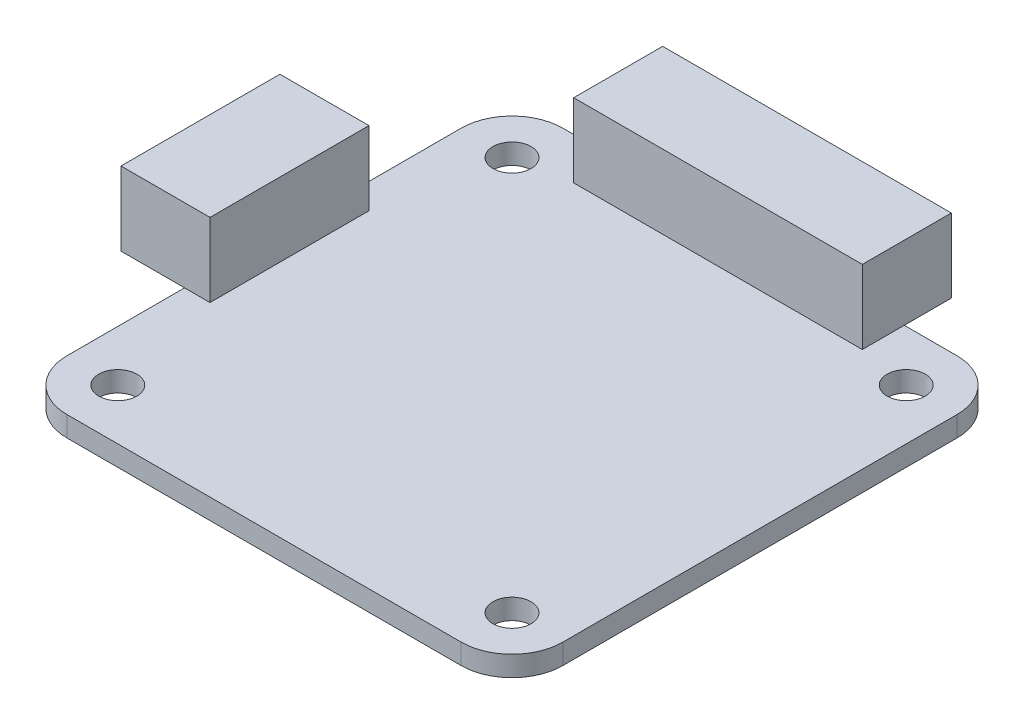
ISO-10303-21;
HEADER;
FILE_DESCRIPTION(('STEP AP214'),'2;1');
FILE_NAME('part.step','',(''),(''),'','','');
FILE_SCHEMA(('AUTOMOTIVE_DESIGN { 1 0 10303 214 1 1 1 1 }'));
ENDSEC;
DATA;
#1=APPLICATION_CONTEXT('core data for automotive mechanical design processes');
#2=APPLICATION_PROTOCOL_DEFINITION('international standard','automotive_design',2000,#1);
#3=PRODUCT_CONTEXT('',#1,'mechanical');
#4=PRODUCT('Part','Part','',(#3));
#5=PRODUCT_RELATED_PRODUCT_CATEGORY('part','',(#4));
#6=PRODUCT_DEFINITION_FORMATION('','',#4);
#7=PRODUCT_DEFINITION_CONTEXT('part definition',#1,'design');
#8=PRODUCT_DEFINITION('design','',#6,#7);
#9=PRODUCT_DEFINITION_SHAPE('','',#8);
#10=(LENGTH_UNIT() NAMED_UNIT(*) SI_UNIT(.MILLI.,.METRE.));
#11=(NAMED_UNIT(*) PLANE_ANGLE_UNIT() SI_UNIT($,.RADIAN.));
#12=(NAMED_UNIT(*) SI_UNIT($,.STERADIAN.) SOLID_ANGLE_UNIT());
#13=UNCERTAINTY_MEASURE_WITH_UNIT(LENGTH_MEASURE(1.E-05),#10,'distance_accuracy_value','');
#14=(GEOMETRIC_REPRESENTATION_CONTEXT(3) GLOBAL_UNCERTAINTY_ASSIGNED_CONTEXT((#13)) GLOBAL_UNIT_ASSIGNED_CONTEXT((#10,
#11,#12)) REPRESENTATION_CONTEXT('',''));
#15=CARTESIAN_POINT('',(0.,0.,0.));
#16=DIRECTION('',(0.,0.,1.));
#17=DIRECTION('',(1.,0.,0.));
#18=AXIS2_PLACEMENT_3D('',#15,#16,#17);
#19=CARTESIAN_POINT('',(-15.5,1.6,15.5));
#20=DIRECTION('',(0.,1.,0.));
#21=DIRECTION('',(0.,0.,1.));
#22=AXIS2_PLACEMENT_3D('',#19,#20,#21);
#23=PLANE('',#22);
#24=DIRECTION('',(1.,0.,0.));
#25=VECTOR('',#24,1.);
#26=CARTESIAN_POINT('',(-15.5,1.6,-6.25));
#27=LINE('',#26,#25);
#28=CARTESIAN_POINT('',(-19.5,1.6,-6.25));
#29=VERTEX_POINT('',#28);
#30=CARTESIAN_POINT('',(-17.5,1.6,-6.25));
#31=VERTEX_POINT('',#30);
#32=EDGE_CURVE('E52',#29,#31,#27,.T.);
#33=ORIENTED_EDGE('',*,*,#32,.T.);
#34=DIRECTION('',(0.,0.,1.));
#35=VECTOR('',#34,1.);
#36=CARTESIAN_POINT('',(-17.5,1.6,15.5));
#37=LINE('',#36,#35);
#38=CARTESIAN_POINT('',(-17.5,1.6,6.25));
#39=VERTEX_POINT('',#38);
#40=EDGE_CURVE('E57',#31,#39,#37,.T.);
#41=ORIENTED_EDGE('',*,*,#40,.T.);
#42=DIRECTION('',(-1.,0.,0.));
#43=VECTOR('',#42,1.);
#44=CARTESIAN_POINT('',(-15.5,1.6,6.25000000000001));
#45=LINE('',#44,#43);
#46=CARTESIAN_POINT('',(-19.5,1.6,6.25));
#47=VERTEX_POINT('',#46);
#48=EDGE_CURVE('E169',#39,#47,#45,.T.);
#49=ORIENTED_EDGE('',*,*,#48,.T.);
#50=DIRECTION('',(0.,0.,1.));
#51=VECTOR('',#50,1.);
#52=CARTESIAN_POINT('',(-19.5,1.6,15.5));
#53=LINE('',#52,#51);
#54=CARTESIAN_POINT('',(-19.5,1.6,15.5));
#55=VERTEX_POINT('',#54);
#56=EDGE_CURVE('E281',#47,#55,#53,.T.);
#57=ORIENTED_EDGE('',*,*,#56,.T.);
#58=CARTESIAN_POINT('',(-15.5,1.6,15.5));
#59=DIRECTION('',(0.,1.,0.));
#60=DIRECTION('',(0.,0.,1.));
#61=AXIS2_PLACEMENT_3D('',#58,#59,#60);
#62=CIRCLE('',#61,4.);
#63=CARTESIAN_POINT('',(-15.5,1.6,19.5));
#64=VERTEX_POINT('',#63);
#65=EDGE_CURVE('E262',#55,#64,#62,.T.);
#66=ORIENTED_EDGE('',*,*,#65,.T.);
#67=DIRECTION('',(1.,0.,0.));
#68=VECTOR('',#67,1.);
#69=CARTESIAN_POINT('',(-15.5,1.6,19.5));
#70=LINE('',#69,#68);
#71=CARTESIAN_POINT('',(15.5,1.6,19.5));
#72=VERTEX_POINT('',#71);
#73=EDGE_CURVE('E265',#64,#72,#70,.T.);
#74=ORIENTED_EDGE('',*,*,#73,.T.);
#75=CARTESIAN_POINT('',(15.5,1.6,15.5));
#76=DIRECTION('',(0.,1.,0.));
#77=DIRECTION('',(0.,0.,1.));
#78=AXIS2_PLACEMENT_3D('',#75,#76,#77);
#79=CIRCLE('',#78,4.);
#80=CARTESIAN_POINT('',(19.5,1.6,15.5));
#81=VERTEX_POINT('',#80);
#82=EDGE_CURVE('E268',#72,#81,#79,.T.);
#83=ORIENTED_EDGE('',*,*,#82,.T.);
#84=DIRECTION('',(0.,0.,-1.));
#85=VECTOR('',#84,1.);
#86=CARTESIAN_POINT('',(19.5,1.6,15.5));
#87=LINE('',#86,#85);
#88=CARTESIAN_POINT('',(19.5,1.6,-15.5));
#89=VERTEX_POINT('',#88);
#90=EDGE_CURVE('E270',#81,#89,#87,.T.);
#91=ORIENTED_EDGE('',*,*,#90,.T.);
#92=CARTESIAN_POINT('',(15.5,1.6,-15.5));
#93=DIRECTION('',(0.,1.,0.));
#94=DIRECTION('',(0.,0.,1.));
#95=AXIS2_PLACEMENT_3D('',#92,#93,#94);
#96=CIRCLE('',#95,4.);
#97=CARTESIAN_POINT('',(15.5,1.6,-19.5));
#98=VERTEX_POINT('',#97);
#99=EDGE_CURVE('E272',#89,#98,#96,.T.);
#100=ORIENTED_EDGE('',*,*,#99,.T.);
#101=DIRECTION('',(-1.,0.,0.));
#102=VECTOR('',#101,1.);
#103=CARTESIAN_POINT('',(-15.5,1.6,-19.5));
#104=LINE('',#103,#102);
#105=CARTESIAN_POINT('',(11.35,1.6,-19.5));
#106=VERTEX_POINT('',#105);
#107=EDGE_CURVE('E275',#98,#106,#104,.T.);
#108=ORIENTED_EDGE('',*,*,#107,.T.);
#109=DIRECTION('',(0.,0.,1.));
#110=VECTOR('',#109,1.);
#111=CARTESIAN_POINT('',(11.35,1.6,15.5));
#112=LINE('',#111,#110);
#113=CARTESIAN_POINT('',(11.35,1.6,-16.2));
#114=VERTEX_POINT('',#113);
#115=EDGE_CURVE('E11',#106,#114,#112,.T.);
#116=ORIENTED_EDGE('',*,*,#115,.T.);
#117=DIRECTION('',(-1.,0.,0.));
#118=VECTOR('',#117,1.);
#119=CARTESIAN_POINT('',(-15.5,1.6,-16.2));
#120=LINE('',#119,#118);
#121=CARTESIAN_POINT('',(-11.35,1.6,-16.2));
#122=VERTEX_POINT('',#121);
#123=EDGE_CURVE('E201',#114,#122,#120,.T.);
#124=ORIENTED_EDGE('',*,*,#123,.T.);
#125=DIRECTION('',(0.,0.,-1.));
#126=VECTOR('',#125,1.);
#127=CARTESIAN_POINT('',(-11.35,1.6,15.5));
#128=LINE('',#127,#126);
#129=CARTESIAN_POINT('',(-11.35,1.6,-19.5));
#130=VERTEX_POINT('',#129);
#131=EDGE_CURVE('E221',#122,#130,#128,.T.);
#132=ORIENTED_EDGE('',*,*,#131,.T.);
#133=CARTESIAN_POINT('',(-15.5,1.6,-19.5));
#134=VERTEX_POINT('',#133);
#135=EDGE_CURVE('E274',#130,#134,#104,.T.);
#136=ORIENTED_EDGE('',*,*,#135,.T.);
#137=CARTESIAN_POINT('',(-15.5,1.6,-15.5));
#138=DIRECTION('',(0.,1.,0.));
#139=DIRECTION('',(0.,0.,1.));
#140=AXIS2_PLACEMENT_3D('',#137,#138,#139);
#141=CIRCLE('',#140,4.);
#142=CARTESIAN_POINT('',(-19.5,1.6,-15.5));
#143=VERTEX_POINT('',#142);
#144=EDGE_CURVE('E278',#134,#143,#141,.T.);
#145=ORIENTED_EDGE('',*,*,#144,.T.);
#146=EDGE_CURVE('E282',#143,#29,#53,.T.);
#147=ORIENTED_EDGE('',*,*,#146,.T.);
#148=EDGE_LOOP('',(#33,#41,#49,#57,#66,#74,#83,#91,#100,#108,#116,#124,#132,#136,#145,#147));
#149=FACE_BOUND('',#148,.T.);
#150=CARTESIAN_POINT('',(-15.5,1.6,-15.5));
#151=DIRECTION('',(0.,1.,0.));
#152=DIRECTION('',(0.,0.,1.));
#153=AXIS2_PLACEMENT_3D('',#150,#151,#152);
#154=CIRCLE('',#153,1.5);
#155=CARTESIAN_POINT('',(-15.5,1.6,-14.));
#156=VERTEX_POINT('',#155);
#157=EDGE_CURVE('E244',#156,#156,#154,.T.);
#158=ORIENTED_EDGE('',*,*,#157,.F.);
#159=EDGE_LOOP('',(#158));
#160=FACE_BOUND('',#159,.T.);
#161=CARTESIAN_POINT('',(-15.5,1.6,15.5));
#162=DIRECTION('',(0.,1.,0.));
#163=DIRECTION('',(0.,0.,1.));
#164=AXIS2_PLACEMENT_3D('',#161,#162,#163);
#165=CIRCLE('',#164,1.5);
#166=CARTESIAN_POINT('',(-15.5,1.6,17.));
#167=VERTEX_POINT('',#166);
#168=EDGE_CURVE('E256',#167,#167,#165,.T.);
#169=ORIENTED_EDGE('',*,*,#168,.F.);
#170=EDGE_LOOP('',(#169));
#171=FACE_BOUND('',#170,.T.);
#172=CARTESIAN_POINT('',(15.5,1.6,15.5));
#173=DIRECTION('',(0.,1.,0.));
#174=DIRECTION('',(0.,0.,1.));
#175=AXIS2_PLACEMENT_3D('',#172,#173,#174);
#176=CIRCLE('',#175,1.5);
#177=CARTESIAN_POINT('',(15.5,1.6,17.));
#178=VERTEX_POINT('',#177);
#179=EDGE_CURVE('E250',#178,#178,#176,.T.);
#180=ORIENTED_EDGE('',*,*,#179,.F.);
#181=EDGE_LOOP('',(#180));
#182=FACE_BOUND('',#181,.T.);
#183=CARTESIAN_POINT('',(15.5,1.6,-15.5));
#184=DIRECTION('',(0.,1.,0.));
#185=DIRECTION('',(0.,0.,1.));
#186=AXIS2_PLACEMENT_3D('',#183,#184,#185);
#187=CIRCLE('',#186,1.5);
#188=CARTESIAN_POINT('',(15.5,1.6,-14.));
#189=VERTEX_POINT('',#188);
#190=EDGE_CURVE('E238',#189,#189,#187,.T.);
#191=ORIENTED_EDGE('',*,*,#190,.F.);
#192=EDGE_LOOP('',(#191));
#193=FACE_BOUND('',#192,.T.);
#194=ADVANCED_FACE('F35',(#149,#160,#171,#182,#193),#23,.T.);
#195=CARTESIAN_POINT('',(-15.5,0.,15.5));
#196=DIRECTION('',(0.,1.,0.));
#197=DIRECTION('',(0.,0.,1.));
#198=AXIS2_PLACEMENT_3D('',#195,#196,#197);
#199=PLANE('',#198);
#200=CARTESIAN_POINT('',(-15.5,0.,15.5));
#201=DIRECTION('',(0.,1.,0.));
#202=DIRECTION('',(0.,0.,1.));
#203=AXIS2_PLACEMENT_3D('',#200,#201,#202);
#204=CIRCLE('',#203,4.);
#205=CARTESIAN_POINT('',(-19.5,0.,15.5));
#206=VERTEX_POINT('',#205);
#207=CARTESIAN_POINT('',(-15.5,0.,19.5));
#208=VERTEX_POINT('',#207);
#209=EDGE_CURVE('E259',#206,#208,#204,.T.);
#210=ORIENTED_EDGE('',*,*,#209,.F.);
#211=DIRECTION('',(0.,0.,1.));
#212=VECTOR('',#211,1.);
#213=CARTESIAN_POINT('',(-19.5,0.,15.5));
#214=LINE('',#213,#212);
#215=CARTESIAN_POINT('',(-19.5,0.,-15.5));
#216=VERTEX_POINT('',#215);
#217=EDGE_CURVE('E266',#216,#206,#214,.T.);
#218=ORIENTED_EDGE('',*,*,#217,.F.);
#219=CARTESIAN_POINT('',(-15.5,0.,-15.5));
#220=DIRECTION('',(0.,1.,0.));
#221=DIRECTION('',(0.,0.,1.));
#222=AXIS2_PLACEMENT_3D('',#219,#220,#221);
#223=CIRCLE('',#222,4.);
#224=CARTESIAN_POINT('',(-15.5,0.,-19.5));
#225=VERTEX_POINT('',#224);
#226=EDGE_CURVE('E298',#225,#216,#223,.T.);
#227=ORIENTED_EDGE('',*,*,#226,.F.);
#228=DIRECTION('',(-1.,0.,0.));
#229=VECTOR('',#228,1.);
#230=CARTESIAN_POINT('',(-15.5,0.,-19.5));
#231=LINE('',#230,#229);
#232=CARTESIAN_POINT('',(15.5,0.,-19.5));
#233=VERTEX_POINT('',#232);
#234=EDGE_CURVE('E296',#233,#225,#231,.T.);
#235=ORIENTED_EDGE('',*,*,#234,.F.);
#236=CARTESIAN_POINT('',(15.5,0.,-15.5));
#237=DIRECTION('',(0.,1.,0.));
#238=DIRECTION('',(0.,0.,1.));
#239=AXIS2_PLACEMENT_3D('',#236,#237,#238);
#240=CIRCLE('',#239,4.);
#241=CARTESIAN_POINT('',(19.5,0.,-15.5));
#242=VERTEX_POINT('',#241);
#243=EDGE_CURVE('E294',#242,#233,#240,.T.);
#244=ORIENTED_EDGE('',*,*,#243,.F.);
#245=DIRECTION('',(0.,0.,-1.));
#246=VECTOR('',#245,1.);
#247=CARTESIAN_POINT('',(19.5,0.,15.5));
#248=LINE('',#247,#246);
#249=CARTESIAN_POINT('',(19.5,0.,15.5));
#250=VERTEX_POINT('',#249);
#251=EDGE_CURVE('E292',#250,#242,#248,.T.);
#252=ORIENTED_EDGE('',*,*,#251,.F.);
#253=CARTESIAN_POINT('',(15.5,0.,15.5));
#254=DIRECTION('',(0.,1.,0.));
#255=DIRECTION('',(0.,0.,1.));
#256=AXIS2_PLACEMENT_3D('',#253,#254,#255);
#257=CIRCLE('',#256,4.);
#258=CARTESIAN_POINT('',(15.5,0.,19.5));
#259=VERTEX_POINT('',#258);
#260=EDGE_CURVE('E290',#259,#250,#257,.T.);
#261=ORIENTED_EDGE('',*,*,#260,.F.);
#262=DIRECTION('',(1.,0.,0.));
#263=VECTOR('',#262,1.);
#264=CARTESIAN_POINT('',(-15.5,0.,19.5));
#265=LINE('',#264,#263);
#266=EDGE_CURVE('E288',#208,#259,#265,.T.);
#267=ORIENTED_EDGE('',*,*,#266,.F.);
#268=EDGE_LOOP('',(#210,#218,#227,#235,#244,#252,#261,#267));
#269=FACE_BOUND('',#268,.T.);
#270=CARTESIAN_POINT('',(-15.5,0.,15.5));
#271=DIRECTION('',(0.,1.,0.));
#272=DIRECTION('',(0.,0.,1.));
#273=AXIS2_PLACEMENT_3D('',#270,#271,#272);
#274=CIRCLE('',#273,1.5);
#275=CARTESIAN_POINT('',(-15.5,0.,17.));
#276=VERTEX_POINT('',#275);
#277=EDGE_CURVE('E253',#276,#276,#274,.T.);
#278=ORIENTED_EDGE('',*,*,#277,.T.);
#279=EDGE_LOOP('',(#278));
#280=FACE_BOUND('',#279,.T.);
#281=CARTESIAN_POINT('',(15.5,0.,15.5));
#282=DIRECTION('',(0.,1.,0.));
#283=DIRECTION('',(0.,0.,1.));
#284=AXIS2_PLACEMENT_3D('',#281,#282,#283);
#285=CIRCLE('',#284,1.5);
#286=CARTESIAN_POINT('',(15.5,0.,17.));
#287=VERTEX_POINT('',#286);
#288=EDGE_CURVE('E247',#287,#287,#285,.T.);
#289=ORIENTED_EDGE('',*,*,#288,.T.);
#290=EDGE_LOOP('',(#289));
#291=FACE_BOUND('',#290,.T.);
#292=CARTESIAN_POINT('',(-15.5,0.,-15.5));
#293=DIRECTION('',(0.,1.,0.));
#294=DIRECTION('',(0.,0.,1.));
#295=AXIS2_PLACEMENT_3D('',#292,#293,#294);
#296=CIRCLE('',#295,1.5);
#297=CARTESIAN_POINT('',(-15.5,0.,-14.));
#298=VERTEX_POINT('',#297);
#299=EDGE_CURVE('E241',#298,#298,#296,.T.);
#300=ORIENTED_EDGE('',*,*,#299,.T.);
#301=EDGE_LOOP('',(#300));
#302=FACE_BOUND('',#301,.T.);
#303=CARTESIAN_POINT('',(15.5,0.,-15.5));
#304=DIRECTION('',(0.,1.,0.));
#305=DIRECTION('',(0.,0.,1.));
#306=AXIS2_PLACEMENT_3D('',#303,#304,#305);
#307=CIRCLE('',#306,1.5);
#308=CARTESIAN_POINT('',(15.5,0.,-14.));
#309=VERTEX_POINT('',#308);
#310=EDGE_CURVE('E231',#309,#309,#307,.T.);
#311=ORIENTED_EDGE('',*,*,#310,.T.);
#312=EDGE_LOOP('',(#311));
#313=FACE_BOUND('',#312,.T.);
#314=ADVANCED_FACE('F333',(#269,#280,#291,#302,#313),#199,.F.);
#315=CARTESIAN_POINT('',(-15.5,1.6,15.5));
#316=DIRECTION('',(0.,-1.,0.));
#317=DIRECTION('',(0.,0.,-1.));
#318=AXIS2_PLACEMENT_3D('',#315,#316,#317);
#319=CYLINDRICAL_SURFACE('',#318,4.);
#320=ORIENTED_EDGE('',*,*,#209,.T.);
#321=DIRECTION('',(0.,-1.,0.));
#322=VECTOR('',#321,1.);
#323=CARTESIAN_POINT('',(-15.5,1.6,19.5));
#324=LINE('',#323,#322);
#325=EDGE_CURVE('E39',#64,#208,#324,.T.);
#326=ORIENTED_EDGE('',*,*,#325,.F.);
#327=ORIENTED_EDGE('',*,*,#65,.F.);
#328=DIRECTION('',(0.,-1.,0.));
#329=VECTOR('',#328,1.);
#330=CARTESIAN_POINT('',(-19.5,1.6,15.5));
#331=LINE('',#330,#329);
#332=EDGE_CURVE('E284',#55,#206,#331,.T.);
#333=ORIENTED_EDGE('',*,*,#332,.T.);
#334=EDGE_LOOP('',(#320,#326,#327,#333));
#335=FACE_BOUND('',#334,.T.);
#336=ADVANCED_FACE('F37',(#335),#319,.T.);
#337=CARTESIAN_POINT('',(-15.5,1.6,19.5));
#338=DIRECTION('',(0.,0.,-1.));
#339=DIRECTION('',(-1.,0.,0.));
#340=AXIS2_PLACEMENT_3D('',#337,#338,#339);
#341=PLANE('',#340);
#342=ORIENTED_EDGE('',*,*,#266,.T.);
#343=DIRECTION('',(0.,-1.,0.));
#344=VECTOR('',#343,1.);
#345=CARTESIAN_POINT('',(15.5,1.6,19.5));
#346=LINE('',#345,#344);
#347=EDGE_CURVE('E317',#72,#259,#346,.T.);
#348=ORIENTED_EDGE('',*,*,#347,.F.);
#349=ORIENTED_EDGE('',*,*,#73,.F.);
#350=ORIENTED_EDGE('',*,*,#325,.T.);
#351=EDGE_LOOP('',(#342,#348,#349,#350));
#352=FACE_BOUND('',#351,.T.);
#353=ADVANCED_FACE('F326',(#352),#341,.F.);
#354=CARTESIAN_POINT('',(15.5,1.6,15.5));
#355=DIRECTION('',(0.,-1.,0.));
#356=DIRECTION('',(0.,0.,-1.));
#357=AXIS2_PLACEMENT_3D('',#354,#355,#356);
#358=CYLINDRICAL_SURFACE('',#357,4.);
#359=ORIENTED_EDGE('',*,*,#260,.T.);
#360=DIRECTION('',(0.,-1.,0.));
#361=VECTOR('',#360,1.);
#362=CARTESIAN_POINT('',(19.5,1.6,15.5));
#363=LINE('',#362,#361);
#364=EDGE_CURVE('E315',#81,#250,#363,.T.);
#365=ORIENTED_EDGE('',*,*,#364,.F.);
#366=ORIENTED_EDGE('',*,*,#82,.F.);
#367=ORIENTED_EDGE('',*,*,#347,.T.);
#368=EDGE_LOOP('',(#359,#365,#366,#367));
#369=FACE_BOUND('',#368,.T.);
#370=ADVANCED_FACE('F339',(#369),#358,.T.);
#371=CARTESIAN_POINT('',(19.5,1.6,15.5));
#372=DIRECTION('',(-1.,0.,0.));
#373=DIRECTION('',(0.,0.,1.));
#374=AXIS2_PLACEMENT_3D('',#371,#372,#373);
#375=PLANE('',#374);
#376=ORIENTED_EDGE('',*,*,#251,.T.);
#377=DIRECTION('',(0.,-1.,0.));
#378=VECTOR('',#377,1.);
#379=CARTESIAN_POINT('',(19.5,1.6,-15.5));
#380=LINE('',#379,#378);
#381=EDGE_CURVE('E312',#89,#242,#380,.T.);
#382=ORIENTED_EDGE('',*,*,#381,.F.);
#383=ORIENTED_EDGE('',*,*,#90,.F.);
#384=ORIENTED_EDGE('',*,*,#364,.T.);
#385=EDGE_LOOP('',(#376,#382,#383,#384));
#386=FACE_BOUND('',#385,.T.);
#387=ADVANCED_FACE('F342',(#386),#375,.F.);
#388=CARTESIAN_POINT('',(15.5,1.6,-15.5));
#389=DIRECTION('',(0.,-1.,0.));
#390=DIRECTION('',(0.,0.,-1.));
#391=AXIS2_PLACEMENT_3D('',#388,#389,#390);
#392=CYLINDRICAL_SURFACE('',#391,4.);
#393=ORIENTED_EDGE('',*,*,#243,.T.);
#394=DIRECTION('',(0.,-1.,0.));
#395=VECTOR('',#394,1.);
#396=CARTESIAN_POINT('',(15.5,1.6,-19.5));
#397=LINE('',#396,#395);
#398=EDGE_CURVE('E309',#98,#233,#397,.T.);
#399=ORIENTED_EDGE('',*,*,#398,.F.);
#400=ORIENTED_EDGE('',*,*,#99,.F.);
#401=ORIENTED_EDGE('',*,*,#381,.T.);
#402=EDGE_LOOP('',(#393,#399,#400,#401));
#403=FACE_BOUND('',#402,.T.);
#404=ADVANCED_FACE('F363',(#403),#392,.T.);
#405=CARTESIAN_POINT('',(-15.5,1.6,-19.5));
#406=DIRECTION('',(0.,0.,1.));
#407=DIRECTION('',(1.,0.,0.));
#408=AXIS2_PLACEMENT_3D('',#405,#406,#407);
#409=PLANE('',#408);
#410=ORIENTED_EDGE('',*,*,#234,.T.);
#411=DIRECTION('',(0.,-1.,0.));
#412=VECTOR('',#411,1.);
#413=CARTESIAN_POINT('',(-15.5,1.6,-19.5));
#414=LINE('',#413,#412);
#415=EDGE_CURVE('E306',#134,#225,#414,.T.);
#416=ORIENTED_EDGE('',*,*,#415,.F.);
#417=ORIENTED_EDGE('',*,*,#135,.F.);
#418=EDGE_CURVE('E279',#106,#130,#104,.T.);
#419=ORIENTED_EDGE('',*,*,#418,.F.);
#420=ORIENTED_EDGE('',*,*,#107,.F.);
#421=ORIENTED_EDGE('',*,*,#398,.T.);
#422=EDGE_LOOP('',(#410,#416,#417,#419,#420,#421));
#423=FACE_BOUND('',#422,.T.);
#424=ADVANCED_FACE('F358',(#423),#409,.F.);
#425=CARTESIAN_POINT('',(-15.5,1.6,-15.5));
#426=DIRECTION('',(0.,-1.,0.));
#427=DIRECTION('',(0.,0.,-1.));
#428=AXIS2_PLACEMENT_3D('',#425,#426,#427);
#429=CYLINDRICAL_SURFACE('',#428,4.);
#430=ORIENTED_EDGE('',*,*,#226,.T.);
#431=DIRECTION('',(0.,-1.,0.));
#432=VECTOR('',#431,1.);
#433=CARTESIAN_POINT('',(-19.5,1.6,-15.5));
#434=LINE('',#433,#432);
#435=EDGE_CURVE('E303',#143,#216,#434,.T.);
#436=ORIENTED_EDGE('',*,*,#435,.F.);
#437=ORIENTED_EDGE('',*,*,#144,.F.);
#438=ORIENTED_EDGE('',*,*,#415,.T.);
#439=EDGE_LOOP('',(#430,#436,#437,#438));
#440=FACE_BOUND('',#439,.T.);
#441=ADVANCED_FACE('F354',(#440),#429,.T.);
#442=CARTESIAN_POINT('',(-19.5,1.6,15.5));
#443=DIRECTION('',(1.,0.,0.));
#444=DIRECTION('',(0.,0.,-1.));
#445=AXIS2_PLACEMENT_3D('',#442,#443,#444);
#446=PLANE('',#445);
#447=ORIENTED_EDGE('',*,*,#217,.T.);
#448=ORIENTED_EDGE('',*,*,#332,.F.);
#449=ORIENTED_EDGE('',*,*,#56,.F.);
#450=EDGE_CURVE('E285',#29,#47,#53,.T.);
#451=ORIENTED_EDGE('',*,*,#450,.F.);
#452=ORIENTED_EDGE('',*,*,#146,.F.);
#453=ORIENTED_EDGE('',*,*,#435,.T.);
#454=EDGE_LOOP('',(#447,#448,#449,#451,#452,#453));
#455=FACE_BOUND('',#454,.T.);
#456=ADVANCED_FACE('F349',(#455),#446,.F.);
#457=CARTESIAN_POINT('',(-15.5,1.6,15.5));
#458=DIRECTION('',(0.,-1.,0.));
#459=DIRECTION('',(0.,0.,-1.));
#460=AXIS2_PLACEMENT_3D('',#457,#458,#459);
#461=CYLINDRICAL_SURFACE('',#460,1.5);
#462=ORIENTED_EDGE('',*,*,#168,.T.);
#463=EDGE_LOOP('',(#462));
#464=FACE_BOUND('',#463,.T.);
#465=ORIENTED_EDGE('',*,*,#277,.F.);
#466=EDGE_LOOP('',(#465));
#467=FACE_BOUND('',#466,.T.);
#468=ADVANCED_FACE('F379',(#464,#467),#461,.F.);
#469=CARTESIAN_POINT('',(15.5,1.6,15.5));
#470=DIRECTION('',(0.,-1.,0.));
#471=DIRECTION('',(0.,0.,-1.));
#472=AXIS2_PLACEMENT_3D('',#469,#470,#471);
#473=CYLINDRICAL_SURFACE('',#472,1.5);
#474=ORIENTED_EDGE('',*,*,#179,.T.);
#475=EDGE_LOOP('',(#474));
#476=FACE_BOUND('',#475,.T.);
#477=ORIENTED_EDGE('',*,*,#288,.F.);
#478=EDGE_LOOP('',(#477));
#479=FACE_BOUND('',#478,.T.);
#480=ADVANCED_FACE('F400',(#476,#479),#473,.F.);
#481=CARTESIAN_POINT('',(-15.5,1.6,-15.5));
#482=DIRECTION('',(0.,-1.,0.));
#483=DIRECTION('',(0.,0.,-1.));
#484=AXIS2_PLACEMENT_3D('',#481,#482,#483);
#485=CYLINDRICAL_SURFACE('',#484,1.5);
#486=ORIENTED_EDGE('',*,*,#157,.T.);
#487=EDGE_LOOP('',(#486));
#488=FACE_BOUND('',#487,.T.);
#489=ORIENTED_EDGE('',*,*,#299,.F.);
#490=EDGE_LOOP('',(#489));
#491=FACE_BOUND('',#490,.T.);
#492=ADVANCED_FACE('F407',(#488,#491),#485,.F.);
#493=CARTESIAN_POINT('',(15.5,1.6,-15.5));
#494=DIRECTION('',(0.,-1.,0.));
#495=DIRECTION('',(0.,0.,-1.));
#496=AXIS2_PLACEMENT_3D('',#493,#494,#495);
#497=CYLINDRICAL_SURFACE('',#496,1.5);
#498=ORIENTED_EDGE('',*,*,#190,.T.);
#499=EDGE_LOOP('',(#498));
#500=FACE_BOUND('',#499,.T.);
#501=ORIENTED_EDGE('',*,*,#310,.F.);
#502=EDGE_LOOP('',(#501));
#503=FACE_BOUND('',#502,.T.);
#504=ADVANCED_FACE('F414',(#500,#503),#497,.F.);
#505=CARTESIAN_POINT('',(-15.5,7.4,-16.2));
#506=DIRECTION('',(0.,0.,1.));
#507=DIRECTION('',(1.,0.,0.));
#508=AXIS2_PLACEMENT_3D('',#505,#506,#507);
#509=PLANE('',#508);
#510=ORIENTED_EDGE('',*,*,#123,.F.);
#511=DIRECTION('',(0.,-1.,0.));
#512=VECTOR('',#511,1.);
#513=CARTESIAN_POINT('',(11.35,7.4,-16.2));
#514=LINE('',#513,#512);
#515=CARTESIAN_POINT('',(11.35,7.4,-16.2));
#516=VERTEX_POINT('',#515);
#517=EDGE_CURVE('E228',#516,#114,#514,.T.);
#518=ORIENTED_EDGE('',*,*,#517,.F.);
#519=DIRECTION('',(-1.,0.,0.));
#520=VECTOR('',#519,1.);
#521=CARTESIAN_POINT('',(-15.5,7.4,-16.2));
#522=LINE('',#521,#520);
#523=CARTESIAN_POINT('',(-11.35,7.4,-16.2));
#524=VERTEX_POINT('',#523);
#525=EDGE_CURVE('E205',#516,#524,#522,.T.);
#526=ORIENTED_EDGE('',*,*,#525,.T.);
#527=DIRECTION('',(0.,-1.,0.));
#528=VECTOR('',#527,1.);
#529=CARTESIAN_POINT('',(-11.35,7.4,-16.2));
#530=LINE('',#529,#528);
#531=EDGE_CURVE('E217',#524,#122,#530,.T.);
#532=ORIENTED_EDGE('',*,*,#531,.T.);
#533=EDGE_LOOP('',(#510,#518,#526,#532));
#534=FACE_BOUND('',#533,.T.);
#535=ADVANCED_FACE('F422',(#534),#509,.T.);
#536=CARTESIAN_POINT('',(11.35,7.4,15.5));
#537=DIRECTION('',(1.,0.,0.));
#538=DIRECTION('',(0.,0.,-1.));
#539=AXIS2_PLACEMENT_3D('',#536,#537,#538);
#540=PLANE('',#539);
#541=CARTESIAN_POINT('',(11.35,1.6,-23.2));
#542=VERTEX_POINT('',#541);
#543=EDGE_CURVE('E45',#542,#106,#112,.T.);
#544=ORIENTED_EDGE('',*,*,#543,.F.);
#545=DIRECTION('',(0.,-1.,0.));
#546=VECTOR('',#545,1.);
#547=CARTESIAN_POINT('',(11.35,7.4,-23.2));
#548=LINE('',#547,#546);
#549=CARTESIAN_POINT('',(11.35,7.4,-23.2));
#550=VERTEX_POINT('',#549);
#551=EDGE_CURVE('E232',#550,#542,#548,.T.);
#552=ORIENTED_EDGE('',*,*,#551,.F.);
#553=DIRECTION('',(0.,0.,1.));
#554=VECTOR('',#553,1.);
#555=CARTESIAN_POINT('',(11.35,7.4,15.5));
#556=LINE('',#555,#554);
#557=EDGE_CURVE('E214',#550,#516,#556,.T.);
#558=ORIENTED_EDGE('',*,*,#557,.T.);
#559=ORIENTED_EDGE('',*,*,#517,.T.);
#560=ORIENTED_EDGE('',*,*,#115,.F.);
#561=EDGE_LOOP('',(#544,#552,#558,#559,#560));
#562=FACE_BOUND('',#561,.T.);
#563=ADVANCED_FACE('F429',(#562),#540,.T.);
#564=CARTESIAN_POINT('',(-15.5,7.4,-23.2));
#565=DIRECTION('',(0.,0.,-1.));
#566=DIRECTION('',(-1.,0.,0.));
#567=AXIS2_PLACEMENT_3D('',#564,#565,#566);
#568=PLANE('',#567);
#569=DIRECTION('',(1.,0.,0.));
#570=VECTOR('',#569,1.);
#571=CARTESIAN_POINT('',(-15.5,1.6,-23.2));
#572=LINE('',#571,#570);
#573=CARTESIAN_POINT('',(-11.35,1.6,-23.2));
#574=VERTEX_POINT('',#573);
#575=EDGE_CURVE('E224',#574,#542,#572,.T.);
#576=ORIENTED_EDGE('',*,*,#575,.F.);
#577=DIRECTION('',(0.,-1.,0.));
#578=VECTOR('',#577,1.);
#579=CARTESIAN_POINT('',(-11.35,7.4,-23.2));
#580=LINE('',#579,#578);
#581=CARTESIAN_POINT('',(-11.35,7.4,-23.2));
#582=VERTEX_POINT('',#581);
#583=EDGE_CURVE('E234',#582,#574,#580,.T.);
#584=ORIENTED_EDGE('',*,*,#583,.F.);
#585=DIRECTION('',(1.,0.,0.));
#586=VECTOR('',#585,1.);
#587=CARTESIAN_POINT('',(-15.5,7.4,-23.2));
#588=LINE('',#587,#586);
#589=EDGE_CURVE('E211',#582,#550,#588,.T.);
#590=ORIENTED_EDGE('',*,*,#589,.T.);
#591=ORIENTED_EDGE('',*,*,#551,.T.);
#592=EDGE_LOOP('',(#576,#584,#590,#591));
#593=FACE_BOUND('',#592,.T.);
#594=ADVANCED_FACE('F437',(#593),#568,.T.);
#595=CARTESIAN_POINT('',(-11.35,7.4,15.5));
#596=DIRECTION('',(-1.,0.,0.));
#597=DIRECTION('',(0.,0.,1.));
#598=AXIS2_PLACEMENT_3D('',#595,#596,#597);
#599=PLANE('',#598);
#600=ORIENTED_EDGE('',*,*,#131,.F.);
#601=ORIENTED_EDGE('',*,*,#531,.F.);
#602=DIRECTION('',(0.,0.,-1.));
#603=VECTOR('',#602,1.);
#604=CARTESIAN_POINT('',(-11.35,7.4,15.5));
#605=LINE('',#604,#603);
#606=EDGE_CURVE('E208',#524,#582,#605,.T.);
#607=ORIENTED_EDGE('',*,*,#606,.T.);
#608=ORIENTED_EDGE('',*,*,#583,.T.);
#609=EDGE_CURVE('E220',#130,#574,#128,.T.);
#610=ORIENTED_EDGE('',*,*,#609,.F.);
#611=EDGE_LOOP('',(#600,#601,#607,#608,#610));
#612=FACE_BOUND('',#611,.T.);
#613=ADVANCED_FACE('F445',(#612),#599,.T.);
#614=CARTESIAN_POINT('',(0.,7.4,0.));
#615=DIRECTION('',(0.,-1.,0.));
#616=DIRECTION('',(0.,0.,-1.));
#617=AXIS2_PLACEMENT_3D('',#614,#615,#616);
#618=PLANE('',#617);
#619=ORIENTED_EDGE('',*,*,#525,.F.);
#620=ORIENTED_EDGE('',*,*,#557,.F.);
#621=ORIENTED_EDGE('',*,*,#589,.F.);
#622=ORIENTED_EDGE('',*,*,#606,.F.);
#623=EDGE_LOOP('',(#619,#620,#621,#622));
#624=FACE_BOUND('',#623,.T.);
#625=ADVANCED_FACE('F453',(#624),#618,.F.);
#626=CARTESIAN_POINT('',(0.,1.6,0.));
#627=DIRECTION('',(0.,-1.,0.));
#628=DIRECTION('',(0.,0.,-1.));
#629=AXIS2_PLACEMENT_3D('',#626,#627,#628);
#630=PLANE('',#629);
#631=ORIENTED_EDGE('',*,*,#543,.T.);
#632=ORIENTED_EDGE('',*,*,#418,.T.);
#633=ORIENTED_EDGE('',*,*,#609,.T.);
#634=ORIENTED_EDGE('',*,*,#575,.T.);
#635=EDGE_LOOP('',(#631,#632,#633,#634));
#636=FACE_BOUND('',#635,.T.);
#637=ADVANCED_FACE('F461',(#636),#630,.T.);
#638=CARTESIAN_POINT('',(0.,1.6,0.));
#639=DIRECTION('',(0.,-1.,0.));
#640=DIRECTION('',(0.,0.,-1.));
#641=AXIS2_PLACEMENT_3D('',#638,#639,#640);
#642=PLANE('',#641);
#643=ORIENTED_EDGE('',*,*,#450,.T.);
#644=CARTESIAN_POINT('',(-24.5,1.6,6.25));
#645=VERTEX_POINT('',#644);
#646=EDGE_CURVE('E195',#47,#645,#45,.T.);
#647=ORIENTED_EDGE('',*,*,#646,.T.);
#648=DIRECTION('',(0.,0.,-1.));
#649=VECTOR('',#648,1.);
#650=CARTESIAN_POINT('',(-24.5,1.6,15.5));
#651=LINE('',#650,#649);
#652=CARTESIAN_POINT('',(-24.5,1.6,-6.25));
#653=VERTEX_POINT('',#652);
#654=EDGE_CURVE('E197',#645,#653,#651,.T.);
#655=ORIENTED_EDGE('',*,*,#654,.T.);
#656=EDGE_CURVE('E187',#653,#29,#27,.T.);
#657=ORIENTED_EDGE('',*,*,#656,.T.);
#658=EDGE_LOOP('',(#643,#647,#655,#657));
#659=FACE_BOUND('',#658,.T.);
#660=ADVANCED_FACE('F469',(#659),#642,.T.);
#661=CARTESIAN_POINT('',(-17.5,7.4,15.5));
#662=DIRECTION('',(1.,0.,0.));
#663=DIRECTION('',(0.,0.,-1.));
#664=AXIS2_PLACEMENT_3D('',#661,#662,#663);
#665=PLANE('',#664);
#666=ORIENTED_EDGE('',*,*,#40,.F.);
#667=DIRECTION('',(0.,-1.,0.));
#668=VECTOR('',#667,1.);
#669=CARTESIAN_POINT('',(-17.5,7.4,-6.25));
#670=LINE('',#669,#668);
#671=CARTESIAN_POINT('',(-17.5,7.4,-6.25));
#672=VERTEX_POINT('',#671);
#673=EDGE_CURVE('E186',#672,#31,#670,.T.);
#674=ORIENTED_EDGE('',*,*,#673,.F.);
#675=DIRECTION('',(0.,0.,1.));
#676=VECTOR('',#675,1.);
#677=CARTESIAN_POINT('',(-17.5,7.4,15.5));
#678=LINE('',#677,#676);
#679=CARTESIAN_POINT('',(-17.5,7.4,6.25));
#680=VERTEX_POINT('',#679);
#681=EDGE_CURVE('E180',#672,#680,#678,.T.);
#682=ORIENTED_EDGE('',*,*,#681,.T.);
#683=DIRECTION('',(0.,-1.,0.));
#684=VECTOR('',#683,1.);
#685=CARTESIAN_POINT('',(-17.5,7.4,6.25));
#686=LINE('',#685,#684);
#687=EDGE_CURVE('E163',#680,#39,#686,.T.);
#688=ORIENTED_EDGE('',*,*,#687,.T.);
#689=EDGE_LOOP('',(#666,#674,#682,#688));
#690=FACE_BOUND('',#689,.T.);
#691=ADVANCED_FACE('F185',(#690),#665,.T.);
#692=CARTESIAN_POINT('',(-15.5,7.4,-6.25));
#693=DIRECTION('',(0.,0.,-1.));
#694=DIRECTION('',(-1.,0.,0.));
#695=AXIS2_PLACEMENT_3D('',#692,#693,#694);
#696=PLANE('',#695);
#697=ORIENTED_EDGE('',*,*,#656,.F.);
#698=DIRECTION('',(0.,-1.,0.));
#699=VECTOR('',#698,1.);
#700=CARTESIAN_POINT('',(-24.5,7.4,-6.25));
#701=LINE('',#700,#699);
#702=CARTESIAN_POINT('',(-24.5,7.4,-6.25));
#703=VERTEX_POINT('',#702);
#704=EDGE_CURVE('E202',#703,#653,#701,.T.);
#705=ORIENTED_EDGE('',*,*,#704,.F.);
#706=DIRECTION('',(1.,0.,0.));
#707=VECTOR('',#706,1.);
#708=CARTESIAN_POINT('',(-15.5,7.4,-6.25));
#709=LINE('',#708,#707);
#710=EDGE_CURVE('E173',#703,#672,#709,.T.);
#711=ORIENTED_EDGE('',*,*,#710,.T.);
#712=ORIENTED_EDGE('',*,*,#673,.T.);
#713=ORIENTED_EDGE('',*,*,#32,.F.);
#714=EDGE_LOOP('',(#697,#705,#711,#712,#713));
#715=FACE_BOUND('',#714,.T.);
#716=ADVANCED_FACE('F484',(#715),#696,.T.);
#717=CARTESIAN_POINT('',(-24.5,7.4,15.5));
#718=DIRECTION('',(-1.,0.,0.));
#719=DIRECTION('',(0.,0.,1.));
#720=AXIS2_PLACEMENT_3D('',#717,#718,#719);
#721=PLANE('',#720);
#722=ORIENTED_EDGE('',*,*,#654,.F.);
#723=DIRECTION('',(0.,-1.,0.));
#724=VECTOR('',#723,1.);
#725=CARTESIAN_POINT('',(-24.5,7.4,6.25));
#726=LINE('',#725,#724);
#727=CARTESIAN_POINT('',(-24.5,7.4,6.25));
#728=VERTEX_POINT('',#727);
#729=EDGE_CURVE('E172',#728,#645,#726,.T.);
#730=ORIENTED_EDGE('',*,*,#729,.F.);
#731=DIRECTION('',(0.,0.,-1.));
#732=VECTOR('',#731,1.);
#733=CARTESIAN_POINT('',(-24.5,7.4,15.5));
#734=LINE('',#733,#732);
#735=EDGE_CURVE('E183',#728,#703,#734,.T.);
#736=ORIENTED_EDGE('',*,*,#735,.T.);
#737=ORIENTED_EDGE('',*,*,#704,.T.);
#738=EDGE_LOOP('',(#722,#730,#736,#737));
#739=FACE_BOUND('',#738,.T.);
#740=ADVANCED_FACE('F491',(#739),#721,.T.);
#741=CARTESIAN_POINT('',(-15.5,7.4,6.25000000000001));
#742=DIRECTION('',(0.,0.,1.));
#743=DIRECTION('',(1.,0.,0.));
#744=AXIS2_PLACEMENT_3D('',#741,#742,#743);
#745=PLANE('',#744);
#746=ORIENTED_EDGE('',*,*,#48,.F.);
#747=ORIENTED_EDGE('',*,*,#687,.F.);
#748=DIRECTION('',(-1.,0.,0.));
#749=VECTOR('',#748,1.);
#750=CARTESIAN_POINT('',(-15.5,7.4,6.25000000000001));
#751=LINE('',#750,#749);
#752=EDGE_CURVE('E167',#680,#728,#751,.T.);
#753=ORIENTED_EDGE('',*,*,#752,.T.);
#754=ORIENTED_EDGE('',*,*,#729,.T.);
#755=ORIENTED_EDGE('',*,*,#646,.F.);
#756=EDGE_LOOP('',(#746,#747,#753,#754,#755));
#757=FACE_BOUND('',#756,.T.);
#758=ADVANCED_FACE('F165',(#757),#745,.T.);
#759=CARTESIAN_POINT('',(0.,7.4,0.));
#760=DIRECTION('',(0.,-1.,0.));
#761=DIRECTION('',(0.,0.,-1.));
#762=AXIS2_PLACEMENT_3D('',#759,#760,#761);
#763=PLANE('',#762);
#764=ORIENTED_EDGE('',*,*,#681,.F.);
#765=ORIENTED_EDGE('',*,*,#710,.F.);
#766=ORIENTED_EDGE('',*,*,#735,.F.);
#767=ORIENTED_EDGE('',*,*,#752,.F.);
#768=EDGE_LOOP('',(#764,#765,#766,#767));
#769=FACE_BOUND('',#768,.T.);
#770=ADVANCED_FACE('F178',(#769),#763,.F.);
#771=CLOSED_SHELL('',(#194,#314,#336,#353,#370,#387,#404,#424,#441,#456,#468,#480,#492,#504,
#535,#563,#594,#613,#625,#637,#660,#691,#716,#740,#758,#770));
#772=MANIFOLD_SOLID_BREP('B2',#771);
#773=ADVANCED_BREP_SHAPE_REPRESENTATION('',(#18,#772),#14);
#774=SHAPE_DEFINITION_REPRESENTATION(#9,#773);
ENDSEC;
END-ISO-10303-21;
